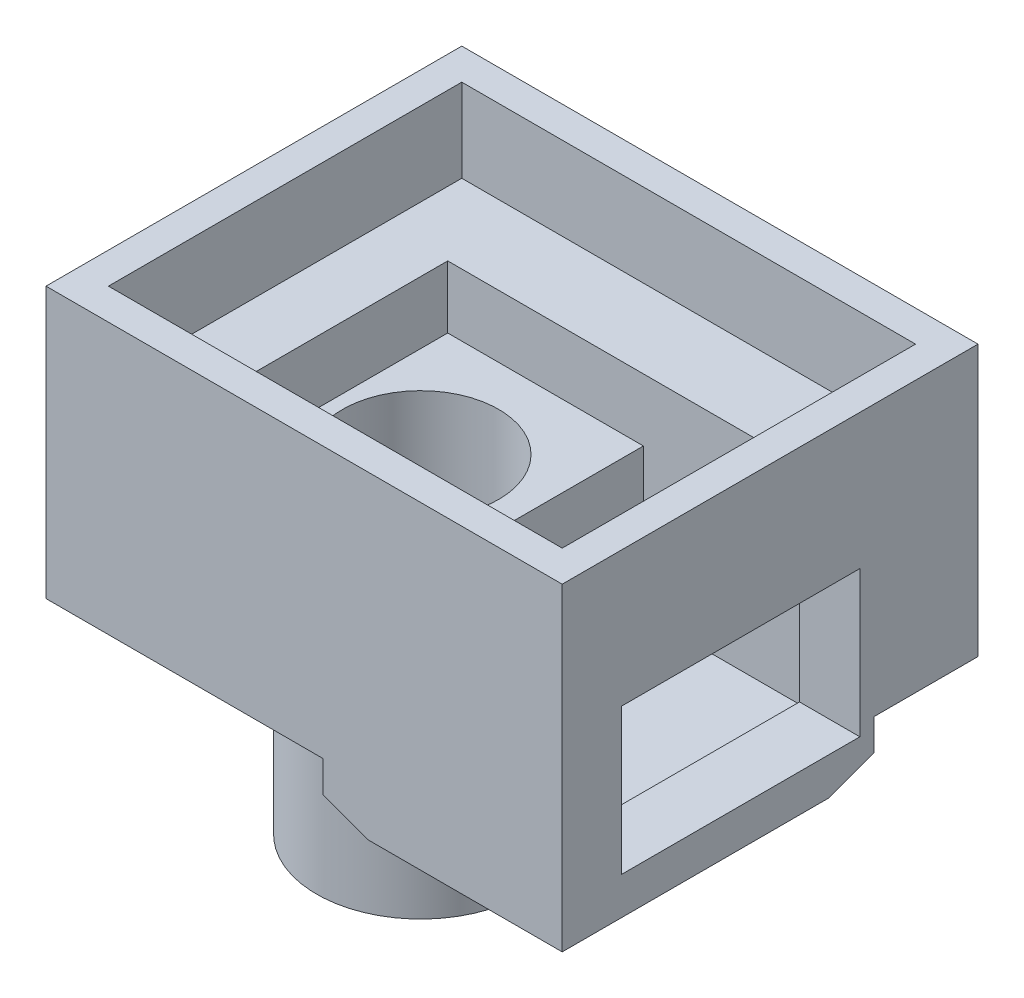
ISO-10303-21;
HEADER;
FILE_DESCRIPTION(('STEP AP214'),'2;1');
FILE_NAME('part.step','',(''),(''),'','','');
FILE_SCHEMA(('AUTOMOTIVE_DESIGN { 1 0 10303 214 1 1 1 1 }'));
ENDSEC;
DATA;
#1=APPLICATION_CONTEXT('core data for automotive mechanical design processes');
#2=APPLICATION_PROTOCOL_DEFINITION('international standard','automotive_design',2000,#1);
#3=PRODUCT_CONTEXT('',#1,'mechanical');
#4=PRODUCT('Part','Part','',(#3));
#5=PRODUCT_RELATED_PRODUCT_CATEGORY('part','',(#4));
#6=PRODUCT_DEFINITION_FORMATION('','',#4);
#7=PRODUCT_DEFINITION_CONTEXT('part definition',#1,'design');
#8=PRODUCT_DEFINITION('design','',#6,#7);
#9=PRODUCT_DEFINITION_SHAPE('','',#8);
#10=(LENGTH_UNIT() NAMED_UNIT(*) SI_UNIT(.MILLI.,.METRE.));
#11=(NAMED_UNIT(*) PLANE_ANGLE_UNIT() SI_UNIT($,.RADIAN.));
#12=(NAMED_UNIT(*) SI_UNIT($,.STERADIAN.) SOLID_ANGLE_UNIT());
#13=UNCERTAINTY_MEASURE_WITH_UNIT(LENGTH_MEASURE(1.E-05),#10,'distance_accuracy_value','');
#14=(GEOMETRIC_REPRESENTATION_CONTEXT(3) GLOBAL_UNCERTAINTY_ASSIGNED_CONTEXT((#13)) GLOBAL_UNIT_ASSIGNED_CONTEXT((#10,
#11,#12)) REPRESENTATION_CONTEXT('',''));
#15=CARTESIAN_POINT('',(0.,0.,0.));
#16=DIRECTION('',(0.,0.,1.));
#17=DIRECTION('',(1.,0.,0.));
#18=AXIS2_PLACEMENT_3D('',#15,#16,#17);
#19=CARTESIAN_POINT('',(15.8,0.,0.));
#20=DIRECTION('',(-1.,0.,0.));
#21=DIRECTION('',(0.,0.,1.));
#22=AXIS2_PLACEMENT_3D('',#19,#20,#21);
#23=PLANE('',#22);
#24=DIRECTION('',(0.,0.,1.));
#25=VECTOR('',#24,1.);
#26=CARTESIAN_POINT('',(15.8,16.3,0.));
#27=LINE('',#26,#25);
#28=CARTESIAN_POINT('',(15.8,16.3,-5.3));
#29=VERTEX_POINT('',#28);
#30=CARTESIAN_POINT('',(15.8,16.3,6.15));
#31=VERTEX_POINT('',#30);
#32=EDGE_CURVE('E252',#29,#31,#27,.T.);
#33=ORIENTED_EDGE('',*,*,#32,.F.);
#34=DIRECTION('',(0.,-1.,0.));
#35=VECTOR('',#34,1.);
#36=CARTESIAN_POINT('',(15.8,0.,-5.3));
#37=LINE('',#36,#35);
#38=CARTESIAN_POINT('',(15.8,9.3,-5.3));
#39=VERTEX_POINT('',#38);
#40=EDGE_CURVE('E264',#29,#39,#37,.T.);
#41=ORIENTED_EDGE('',*,*,#40,.T.);
#42=DIRECTION('',(0.,0.,1.));
#43=VECTOR('',#42,1.);
#44=CARTESIAN_POINT('',(15.8,9.3,0.));
#45=LINE('',#44,#43);
#46=CARTESIAN_POINT('',(15.8,9.3,6.15));
#47=VERTEX_POINT('',#46);
#48=EDGE_CURVE('E266',#39,#47,#45,.T.);
#49=ORIENTED_EDGE('',*,*,#48,.T.);
#50=DIRECTION('',(0.,-1.,0.));
#51=VECTOR('',#50,1.);
#52=CARTESIAN_POINT('',(15.8,0.,6.15));
#53=LINE('',#52,#51);
#54=EDGE_CURVE('E258',#31,#47,#53,.T.);
#55=ORIENTED_EDGE('',*,*,#54,.F.);
#56=EDGE_LOOP('',(#33,#41,#49,#55));
#57=FACE_BOUND('',#56,.T.);
#58=DIRECTION('',(0.,0.,1.));
#59=VECTOR('',#58,1.);
#60=CARTESIAN_POINT('',(15.8,7.5,-5.9749371855331));
#61=LINE('',#60,#59);
#62=CARTESIAN_POINT('',(15.8,7.5,-3.77695524996939));
#63=VERTEX_POINT('',#62);
#64=CARTESIAN_POINT('',(15.8,7.5,9.));
#65=VERTEX_POINT('',#64);
#66=EDGE_CURVE('E581',#63,#65,#61,.T.);
#67=ORIENTED_EDGE('',*,*,#66,.F.);
#68=DIRECTION('',(0.,0.34202014332567,-0.939692620785908));
#69=VECTOR('',#68,1.);
#70=CARTESIAN_POINT('',(15.8,7.5,-3.7769552499694));
#71=LINE('',#70,#69);
#72=CARTESIAN_POINT('',(15.8,8.30000000000001,-5.9749371855331));
#73=VERTEX_POINT('',#72);
#74=EDGE_CURVE('E557',#63,#73,#71,.T.);
#75=ORIENTED_EDGE('',*,*,#74,.T.);
#76=DIRECTION('',(0.,1.,0.));
#77=VECTOR('',#76,1.);
#78=CARTESIAN_POINT('',(15.8,6.8,-5.9749371855331));
#79=LINE('',#78,#77);
#80=CARTESIAN_POINT('',(15.8,9.8,-5.9749371855331));
#81=VERTEX_POINT('',#80);
#82=EDGE_CURVE('E299',#73,#81,#79,.T.);
#83=ORIENTED_EDGE('',*,*,#82,.T.);
#84=DIRECTION('',(0.,0.,-1.));
#85=VECTOR('',#84,1.);
#86=CARTESIAN_POINT('',(15.8,9.8,-5.9749371855331));
#87=LINE('',#86,#85);
#88=CARTESIAN_POINT('',(15.8,9.8,-10.9749371855331));
#89=VERTEX_POINT('',#88);
#90=EDGE_CURVE('E310',#81,#89,#87,.T.);
#91=ORIENTED_EDGE('',*,*,#90,.T.);
#92=DIRECTION('',(0.,1.,0.));
#93=VECTOR('',#92,1.);
#94=CARTESIAN_POINT('',(15.8,9.8,-10.9749371855331));
#95=LINE('',#94,#93);
#96=CARTESIAN_POINT('',(15.8,22.8,-10.9749371855331));
#97=VERTEX_POINT('',#96);
#98=EDGE_CURVE('E311',#89,#97,#95,.T.);
#99=ORIENTED_EDGE('',*,*,#98,.T.);
#100=DIRECTION('',(0.,0.,1.));
#101=VECTOR('',#100,1.);
#102=CARTESIAN_POINT('',(15.8,22.8,-10.9749371855331));
#103=LINE('',#102,#101);
#104=CARTESIAN_POINT('',(15.8,22.8,9.));
#105=VERTEX_POINT('',#104);
#106=EDGE_CURVE('E314',#97,#105,#103,.T.);
#107=ORIENTED_EDGE('',*,*,#106,.T.);
#108=DIRECTION('',(0.,-1.,0.));
#109=VECTOR('',#108,1.);
#110=CARTESIAN_POINT('',(15.8,22.8,9.));
#111=LINE('',#110,#109);
#112=EDGE_CURVE('E316',#105,#65,#111,.T.);
#113=ORIENTED_EDGE('',*,*,#112,.T.);
#114=EDGE_LOOP('',(#67,#75,#83,#91,#99,#107,#113));
#115=FACE_BOUND('',#114,.T.);
#116=ADVANCED_FACE('F47',(#57,#115),#23,.F.);
#117=CARTESIAN_POINT('',(4.3,6.8,-5.9749371855331));
#118=DIRECTION('',(1.,0.,0.));
#119=DIRECTION('',(0.,0.,-1.));
#120=AXIS2_PLACEMENT_3D('',#117,#118,#119);
#121=PLANE('',#120);
#122=DIRECTION('',(0.,-1.,0.));
#123=VECTOR('',#122,1.);
#124=CARTESIAN_POINT('',(4.3,15.8,2.55147016443461));
#125=LINE('',#124,#123);
#126=CARTESIAN_POINT('',(4.3,9.8,2.55147016443462));
#127=VERTEX_POINT('',#126);
#128=CARTESIAN_POINT('',(4.3,8.30000000000001,2.55147016443461));
#129=VERTEX_POINT('',#128);
#130=EDGE_CURVE('E422',#127,#129,#125,.T.);
#131=ORIENTED_EDGE('',*,*,#130,.T.);
#132=DIRECTION('',(0.,0.,1.));
#133=VECTOR('',#132,1.);
#134=CARTESIAN_POINT('',(4.3,8.30000000000001,0.));
#135=LINE('',#134,#133);
#136=CARTESIAN_POINT('',(4.3,8.30000000000001,9.));
#137=VERTEX_POINT('',#136);
#138=EDGE_CURVE('E75',#129,#137,#135,.T.);
#139=ORIENTED_EDGE('',*,*,#138,.T.);
#140=DIRECTION('',(0.,-1.,0.));
#141=VECTOR('',#140,1.);
#142=CARTESIAN_POINT('',(4.3,9.8,9.));
#143=LINE('',#142,#141);
#144=CARTESIAN_POINT('',(4.3,9.8,9.));
#145=VERTEX_POINT('',#144);
#146=EDGE_CURVE('E355',#145,#137,#143,.T.);
#147=ORIENTED_EDGE('',*,*,#146,.F.);
#148=DIRECTION('',(0.,0.,-1.));
#149=VECTOR('',#148,1.);
#150=CARTESIAN_POINT('',(4.3,9.8,-5.9749371855331));
#151=LINE('',#150,#149);
#152=EDGE_CURVE('E409',#145,#127,#151,.T.);
#153=ORIENTED_EDGE('',*,*,#152,.T.);
#154=EDGE_LOOP('',(#131,#139,#147,#153));
#155=FACE_BOUND('',#154,.T.);
#156=ADVANCED_FACE('F611',(#155),#121,.F.);
#157=DIRECTION('',(0.,1.,0.));
#158=VECTOR('',#157,1.);
#159=CARTESIAN_POINT('',(4.3,6.8,-5.9749371855331));
#160=LINE('',#159,#158);
#161=CARTESIAN_POINT('',(4.3,8.30000000000001,-5.9749371855331));
#162=VERTEX_POINT('',#161);
#163=CARTESIAN_POINT('',(4.3,9.8,-5.9749371855331));
#164=VERTEX_POINT('',#163);
#165=EDGE_CURVE('E417',#162,#164,#160,.T.);
#166=ORIENTED_EDGE('',*,*,#165,.F.);
#167=DIRECTION('',(0.,0.,1.));
#168=VECTOR('',#167,1.);
#169=CARTESIAN_POINT('',(4.3,8.30000000000001,-2.55147016443461));
#170=LINE('',#169,#168);
#171=CARTESIAN_POINT('',(4.3,8.30000000000001,-2.55147016443461));
#172=VERTEX_POINT('',#171);
#173=EDGE_CURVE('E566',#162,#172,#170,.T.);
#174=ORIENTED_EDGE('',*,*,#173,.T.);
#175=DIRECTION('',(0.,-1.,0.));
#176=VECTOR('',#175,1.);
#177=CARTESIAN_POINT('',(4.3,15.8,-2.55147016443461));
#178=LINE('',#177,#176);
#179=CARTESIAN_POINT('',(4.3,9.8,-2.55147016443461));
#180=VERTEX_POINT('',#179);
#181=EDGE_CURVE('E416',#172,#180,#178,.F.);
#182=ORIENTED_EDGE('',*,*,#181,.T.);
#183=EDGE_CURVE('E415',#180,#164,#151,.T.);
#184=ORIENTED_EDGE('',*,*,#183,.T.);
#185=EDGE_LOOP('',(#166,#174,#182,#184));
#186=FACE_BOUND('',#185,.T.);
#187=ADVANCED_FACE('F694',(#186),#121,.F.);
#188=CARTESIAN_POINT('',(14.8,6.8,-5.9749371855331));
#189=DIRECTION('',(0.,0.,1.));
#190=DIRECTION('',(1.,0.,0.));
#191=AXIS2_PLACEMENT_3D('',#188,#189,#190);
#192=PLANE('',#191);
#193=ORIENTED_EDGE('',*,*,#82,.F.);
#194=DIRECTION('',(-1.,0.,0.));
#195=VECTOR('',#194,1.);
#196=CARTESIAN_POINT('',(4.3,8.30000000000001,-5.9749371855331));
#197=LINE('',#196,#195);
#198=EDGE_CURVE('E563',#73,#162,#197,.T.);
#199=ORIENTED_EDGE('',*,*,#198,.T.);
#200=ORIENTED_EDGE('',*,*,#165,.T.);
#201=DIRECTION('',(1.,0.,0.));
#202=VECTOR('',#201,1.);
#203=CARTESIAN_POINT('',(14.8,9.8,-5.9749371855331));
#204=LINE('',#203,#202);
#205=EDGE_CURVE('E412',#164,#81,#204,.T.);
#206=ORIENTED_EDGE('',*,*,#205,.T.);
#207=EDGE_LOOP('',(#193,#199,#200,#206));
#208=FACE_BOUND('',#207,.T.);
#209=ADVANCED_FACE('F715',(#208),#192,.F.);
#210=CARTESIAN_POINT('',(12.9,-5.81000925497257,-5.7));
#211=DIRECTION('',(1.,0.,0.));
#212=DIRECTION('',(0.,0.,-1.));
#213=AXIS2_PLACEMENT_3D('',#210,#211,#212);
#214=PLANE('',#213);
#215=DIRECTION('',(0.,0.,1.));
#216=VECTOR('',#215,1.);
#217=CARTESIAN_POINT('',(12.9,18.8,-5.7));
#218=LINE('',#217,#216);
#219=CARTESIAN_POINT('',(12.9,18.8,-5.7));
#220=VERTEX_POINT('',#219);
#221=CARTESIAN_POINT('',(12.9,18.8,7.5));
#222=VERTEX_POINT('',#221);
#223=EDGE_CURVE('E447',#220,#222,#218,.T.);
#224=ORIENTED_EDGE('',*,*,#223,.F.);
#225=DIRECTION('',(0.,1.,0.));
#226=VECTOR('',#225,1.);
#227=CARTESIAN_POINT('',(12.9,-5.81000925497257,-5.7));
#228=LINE('',#227,#226);
#229=CARTESIAN_POINT('',(12.9,8.8,-5.7));
#230=VERTEX_POINT('',#229);
#231=EDGE_CURVE('E464',#230,#220,#228,.T.);
#232=ORIENTED_EDGE('',*,*,#231,.F.);
#233=DIRECTION('',(0.,0.,-1.));
#234=VECTOR('',#233,1.);
#235=CARTESIAN_POINT('',(12.9,8.8,-5.7));
#236=LINE('',#235,#234);
#237=CARTESIAN_POINT('',(12.9,8.8,7.5));
#238=VERTEX_POINT('',#237);
#239=EDGE_CURVE('E395',#238,#230,#236,.T.);
#240=ORIENTED_EDGE('',*,*,#239,.F.);
#241=DIRECTION('',(0.,-1.,0.));
#242=VECTOR('',#241,1.);
#243=CARTESIAN_POINT('',(12.9,18.8,7.5));
#244=LINE('',#243,#242);
#245=EDGE_CURVE('E353',#222,#238,#244,.T.);
#246=ORIENTED_EDGE('',*,*,#245,.F.);
#247=EDGE_LOOP('',(#224,#232,#240,#246));
#248=FACE_BOUND('',#247,.T.);
#249=DIRECTION('',(0.,0.,1.));
#250=VECTOR('',#249,1.);
#251=CARTESIAN_POINT('',(12.9,16.3,0.));
#252=LINE('',#251,#250);
#253=CARTESIAN_POINT('',(12.9,16.3,-5.3));
#254=VERTEX_POINT('',#253);
#255=CARTESIAN_POINT('',(12.9,16.3,6.15));
#256=VERTEX_POINT('',#255);
#257=EDGE_CURVE('E251',#254,#256,#252,.T.);
#258=ORIENTED_EDGE('',*,*,#257,.T.);
#259=DIRECTION('',(0.,-1.,0.));
#260=VECTOR('',#259,1.);
#261=CARTESIAN_POINT('',(12.9,0.,6.15));
#262=LINE('',#261,#260);
#263=CARTESIAN_POINT('',(12.9,9.3,6.15));
#264=VERTEX_POINT('',#263);
#265=EDGE_CURVE('E274',#256,#264,#262,.T.);
#266=ORIENTED_EDGE('',*,*,#265,.T.);
#267=DIRECTION('',(0.,0.,1.));
#268=VECTOR('',#267,1.);
#269=CARTESIAN_POINT('',(12.9,9.3,0.));
#270=LINE('',#269,#268);
#271=CARTESIAN_POINT('',(12.9,9.3,-5.3));
#272=VERTEX_POINT('',#271);
#273=EDGE_CURVE('E279',#272,#264,#270,.T.);
#274=ORIENTED_EDGE('',*,*,#273,.F.);
#275=DIRECTION('',(0.,-1.,0.));
#276=VECTOR('',#275,1.);
#277=CARTESIAN_POINT('',(12.9,0.,-5.3));
#278=LINE('',#277,#276);
#279=EDGE_CURVE('E288',#254,#272,#278,.T.);
#280=ORIENTED_EDGE('',*,*,#279,.F.);
#281=EDGE_LOOP('',(#258,#266,#274,#280));
#282=FACE_BOUND('',#281,.T.);
#283=ADVANCED_FACE('F655',(#248,#282),#214,.F.);
#284=CARTESIAN_POINT('',(0.,18.8,0.));
#285=DIRECTION('',(0.,1.,0.));
#286=DIRECTION('',(0.,0.,1.));
#287=AXIS2_PLACEMENT_3D('',#284,#285,#286);
#288=PLANE('',#287);
#289=DIRECTION('',(1.,0.,0.));
#290=VECTOR('',#289,1.);
#291=CARTESIAN_POINT('',(-7.5,18.8,7.5));
#292=LINE('',#291,#290);
#293=CARTESIAN_POINT('',(-7.5,18.8,7.5));
#294=VERTEX_POINT('',#293);
#295=CARTESIAN_POINT('',(-4.4,18.8,7.5));
#296=VERTEX_POINT('',#295);
#297=EDGE_CURVE('E432',#294,#296,#292,.T.);
#298=ORIENTED_EDGE('',*,*,#297,.T.);
#299=DIRECTION('',(0.,0.,-1.));
#300=VECTOR('',#299,1.);
#301=CARTESIAN_POINT('',(-4.4,18.8,-5.7));
#302=LINE('',#301,#300);
#303=CARTESIAN_POINT('',(-4.4,18.8,-5.7));
#304=VERTEX_POINT('',#303);
#305=EDGE_CURVE('E456',#296,#304,#302,.T.);
#306=ORIENTED_EDGE('',*,*,#305,.T.);
#307=DIRECTION('',(1.,0.,0.));
#308=VECTOR('',#307,1.);
#309=CARTESIAN_POINT('',(-4.4,18.8,-5.7));
#310=LINE('',#309,#308);
#311=EDGE_CURVE('E460',#304,#220,#310,.T.);
#312=ORIENTED_EDGE('',*,*,#311,.T.);
#313=ORIENTED_EDGE('',*,*,#223,.T.);
#314=CARTESIAN_POINT('',(14.3,18.8,7.5));
#315=VERTEX_POINT('',#314);
#316=EDGE_CURVE('E433',#222,#315,#292,.T.);
#317=ORIENTED_EDGE('',*,*,#316,.T.);
#318=DIRECTION('',(0.,0.,-1.));
#319=VECTOR('',#318,1.);
#320=CARTESIAN_POINT('',(14.3,18.8,7.5));
#321=LINE('',#320,#319);
#322=CARTESIAN_POINT('',(14.3,18.8,-9.4749371855331));
#323=VERTEX_POINT('',#322);
#324=EDGE_CURVE('E438',#315,#323,#321,.T.);
#325=ORIENTED_EDGE('',*,*,#324,.T.);
#326=DIRECTION('',(-1.,0.,0.));
#327=VECTOR('',#326,1.);
#328=CARTESIAN_POINT('',(14.3,18.8,-9.4749371855331));
#329=LINE('',#328,#327);
#330=CARTESIAN_POINT('',(-7.5,18.8,-9.4749371855331));
#331=VERTEX_POINT('',#330);
#332=EDGE_CURVE('E424',#323,#331,#329,.T.);
#333=ORIENTED_EDGE('',*,*,#332,.T.);
#334=DIRECTION('',(0.,0.,1.));
#335=VECTOR('',#334,1.);
#336=CARTESIAN_POINT('',(-7.5,18.8,-9.4749371855331));
#337=LINE('',#336,#335);
#338=EDGE_CURVE('E429',#331,#294,#337,.T.);
#339=ORIENTED_EDGE('',*,*,#338,.T.);
#340=EDGE_LOOP('',(#298,#306,#312,#313,#317,#325,#333,#339));
#341=FACE_BOUND('',#340,.T.);
#342=ADVANCED_FACE('F625',(#341),#288,.T.);
#343=CARTESIAN_POINT('',(0.,15.8,0.));
#344=DIRECTION('',(0.,-1.,0.));
#345=DIRECTION('',(0.,0.,-1.));
#346=AXIS2_PLACEMENT_3D('',#343,#344,#345);
#347=CYLINDRICAL_SURFACE('',#346,5.);
#348=ORIENTED_EDGE('',*,*,#181,.F.);
#349=CARTESIAN_POINT('',(0.,9.86507200734468,0.));
#350=DIRECTION('',(-0.34202014332567,-0.939692620785908,0.));
#351=DIRECTION('',(0.939692620785908,-0.34202014332567,0.));
#352=AXIS2_PLACEMENT_3D('',#349,#350,#351);
#353=ELLIPSE('',#352,5.32088886237956,5.);
#354=EDGE_CURVE('E12',#172,#129,#353,.T.);
#355=ORIENTED_EDGE('',*,*,#354,.T.);
#356=ORIENTED_EDGE('',*,*,#130,.F.);
#357=CARTESIAN_POINT('',(0.,9.8,0.));
#358=DIRECTION('',(0.,-1.,0.));
#359=DIRECTION('',(0.,0.,1.));
#360=AXIS2_PLACEMENT_3D('',#357,#358,#359);
#361=CIRCLE('',#360,5.);
#362=CARTESIAN_POINT('',(-0.499999999999996,9.8,-4.9749371855331));
#363=VERTEX_POINT('',#362);
#364=EDGE_CURVE('E475',#127,#363,#361,.T.);
#365=ORIENTED_EDGE('',*,*,#364,.T.);
#366=DIRECTION('',(0.,-1.,0.));
#367=VECTOR('',#366,1.);
#368=CARTESIAN_POINT('',(-0.5,15.8,-4.9749371855331));
#369=LINE('',#368,#367);
#370=CARTESIAN_POINT('',(-0.499999999999993,2.5,-4.9749371855331));
#371=VERTEX_POINT('',#370);
#372=EDGE_CURVE('E503',#363,#371,#369,.T.);
#373=ORIENTED_EDGE('',*,*,#372,.T.);
#374=DIRECTION('',(0.,-1.,0.));
#375=VECTOR('',#374,1.);
#376=CARTESIAN_POINT('',(-0.499999999999993,15.8,-4.9749371855331));
#377=LINE('',#376,#375);
#378=CARTESIAN_POINT('',(-0.5,0.,-4.9749371855331));
#379=VERTEX_POINT('',#378);
#380=EDGE_CURVE('E507',#371,#379,#377,.T.);
#381=ORIENTED_EDGE('',*,*,#380,.T.);
#382=CARTESIAN_POINT('',(0.,0.,0.));
#383=DIRECTION('',(0.,1.,0.));
#384=DIRECTION('',(0.,0.,1.));
#385=AXIS2_PLACEMENT_3D('',#382,#383,#384);
#386=CIRCLE('',#385,5.);
#387=CARTESIAN_POINT('',(0.5,0.,-4.9749371855331));
#388=VERTEX_POINT('',#387);
#389=EDGE_CURVE('E529',#379,#388,#386,.T.);
#390=ORIENTED_EDGE('',*,*,#389,.T.);
#391=DIRECTION('',(0.,-1.,0.));
#392=VECTOR('',#391,1.);
#393=CARTESIAN_POINT('',(0.5,0.,-4.9749371855331));
#394=LINE('',#393,#392);
#395=CARTESIAN_POINT('',(0.5,2.5,-4.9749371855331));
#396=VERTEX_POINT('',#395);
#397=EDGE_CURVE('E494',#396,#388,#394,.T.);
#398=ORIENTED_EDGE('',*,*,#397,.F.);
#399=DIRECTION('',(0.,-1.,0.));
#400=VECTOR('',#399,1.);
#401=CARTESIAN_POINT('',(0.5,15.8,-4.9749371855331));
#402=LINE('',#401,#400);
#403=CARTESIAN_POINT('',(0.5,9.8,-4.9749371855331));
#404=VERTEX_POINT('',#403);
#405=EDGE_CURVE('E545',#404,#396,#402,.T.);
#406=ORIENTED_EDGE('',*,*,#405,.F.);
#407=EDGE_CURVE('E479',#404,#180,#361,.T.);
#408=ORIENTED_EDGE('',*,*,#407,.T.);
#409=EDGE_LOOP('',(#348,#355,#356,#365,#373,#381,#390,#398,#406,#408));
#410=FACE_BOUND('',#409,.T.);
#411=ADVANCED_FACE('F613',(#410),#347,.T.);
#412=CARTESIAN_POINT('',(-4.4,-5.81000925497257,-5.7));
#413=DIRECTION('',(-1.,0.,0.));
#414=DIRECTION('',(0.,0.,1.));
#415=AXIS2_PLACEMENT_3D('',#412,#413,#414);
#416=PLANE('',#415);
#417=DIRECTION('',(0.,1.,0.));
#418=VECTOR('',#417,1.);
#419=CARTESIAN_POINT('',(-4.4,-5.81000925497257,-5.7));
#420=LINE('',#419,#418);
#421=CARTESIAN_POINT('',(-4.4,15.8,-5.7));
#422=VERTEX_POINT('',#421);
#423=EDGE_CURVE('E469',#422,#304,#420,.T.);
#424=ORIENTED_EDGE('',*,*,#423,.T.);
#425=ORIENTED_EDGE('',*,*,#305,.F.);
#426=DIRECTION('',(0.,1.,0.));
#427=VECTOR('',#426,1.);
#428=CARTESIAN_POINT('',(-4.4,15.8,7.5));
#429=LINE('',#428,#427);
#430=CARTESIAN_POINT('',(-4.4,15.8,7.5));
#431=VERTEX_POINT('',#430);
#432=EDGE_CURVE('E358',#431,#296,#429,.T.);
#433=ORIENTED_EDGE('',*,*,#432,.F.);
#434=DIRECTION('',(0.,0.,-1.));
#435=VECTOR('',#434,1.);
#436=CARTESIAN_POINT('',(-4.4,15.8,-5.7));
#437=LINE('',#436,#435);
#438=EDGE_CURVE('E466',#431,#422,#437,.T.);
#439=ORIENTED_EDGE('',*,*,#438,.T.);
#440=EDGE_LOOP('',(#424,#425,#433,#439));
#441=FACE_BOUND('',#440,.T.);
#442=ADVANCED_FACE('F641',(#441),#416,.F.);
#443=CARTESIAN_POINT('',(-4.4,-5.81000925497257,-5.7));
#444=DIRECTION('',(0.,0.,-1.));
#445=DIRECTION('',(-1.,0.,0.));
#446=AXIS2_PLACEMENT_3D('',#443,#444,#445);
#447=PLANE('',#446);
#448=ORIENTED_EDGE('',*,*,#311,.F.);
#449=ORIENTED_EDGE('',*,*,#423,.F.);
#450=DIRECTION('',(1.,0.,0.));
#451=VECTOR('',#450,1.);
#452=CARTESIAN_POINT('',(-4.4,15.8,-5.7));
#453=LINE('',#452,#451);
#454=CARTESIAN_POINT('',(5.,15.8,-5.7));
#455=VERTEX_POINT('',#454);
#456=EDGE_CURVE('E461',#422,#455,#453,.T.);
#457=ORIENTED_EDGE('',*,*,#456,.T.);
#458=DIRECTION('',(0.,1.,0.));
#459=VECTOR('',#458,1.);
#460=CARTESIAN_POINT('',(5.,8.8,-5.7));
#461=LINE('',#460,#459);
#462=CARTESIAN_POINT('',(5.,8.8,-5.7));
#463=VERTEX_POINT('',#462);
#464=EDGE_CURVE('E401',#463,#455,#461,.T.);
#465=ORIENTED_EDGE('',*,*,#464,.F.);
#466=DIRECTION('',(-1.,0.,0.));
#467=VECTOR('',#466,1.);
#468=CARTESIAN_POINT('',(12.9,8.8,-5.7));
#469=LINE('',#468,#467);
#470=EDGE_CURVE('E397',#230,#463,#469,.T.);
#471=ORIENTED_EDGE('',*,*,#470,.F.);
#472=ORIENTED_EDGE('',*,*,#231,.T.);
#473=EDGE_LOOP('',(#448,#449,#457,#465,#471,#472));
#474=FACE_BOUND('',#473,.T.);
#475=ADVANCED_FACE('F646',(#474),#447,.F.);
#476=CARTESIAN_POINT('',(0.,15.8,0.));
#477=DIRECTION('',(0.,1.,0.));
#478=DIRECTION('',(0.,0.,1.));
#479=AXIS2_PLACEMENT_3D('',#476,#477,#478);
#480=PLANE('',#479);
#481=DIRECTION('',(0.,0.,1.));
#482=VECTOR('',#481,1.);
#483=CARTESIAN_POINT('',(5.,15.8,-5.7));
#484=LINE('',#483,#482);
#485=CARTESIAN_POINT('',(5.,15.8,7.5));
#486=VERTEX_POINT('',#485);
#487=EDGE_CURVE('E392',#455,#486,#484,.T.);
#488=ORIENTED_EDGE('',*,*,#487,.F.);
#489=ORIENTED_EDGE('',*,*,#456,.F.);
#490=ORIENTED_EDGE('',*,*,#438,.F.);
#491=DIRECTION('',(-1.,0.,0.));
#492=VECTOR('',#491,1.);
#493=CARTESIAN_POINT('',(5.,15.8,7.5));
#494=LINE('',#493,#492);
#495=EDGE_CURVE('E363',#486,#431,#494,.T.);
#496=ORIENTED_EDGE('',*,*,#495,.F.);
#497=EDGE_LOOP('',(#488,#489,#490,#496));
#498=FACE_BOUND('',#497,.T.);
#499=CARTESIAN_POINT('',(0.,15.8,0.));
#500=DIRECTION('',(0.,1.,0.));
#501=DIRECTION('',(0.,0.,1.));
#502=AXIS2_PLACEMENT_3D('',#499,#500,#501);
#503=CIRCLE('',#502,3.75);
#504=CARTESIAN_POINT('',(0.,15.8,3.75));
#505=VERTEX_POINT('',#504);
#506=EDGE_CURVE('E516',#505,#505,#503,.T.);
#507=ORIENTED_EDGE('',*,*,#506,.F.);
#508=EDGE_LOOP('',(#507));
#509=FACE_BOUND('',#508,.T.);
#510=ADVANCED_FACE('F661',(#498,#509),#480,.T.);
#511=CARTESIAN_POINT('',(0.,15.8,0.));
#512=DIRECTION('',(0.,-1.,0.));
#513=DIRECTION('',(0.,0.,-1.));
#514=AXIS2_PLACEMENT_3D('',#511,#512,#513);
#515=CYLINDRICAL_SURFACE('',#514,2.5);
#516=CARTESIAN_POINT('',(0.,0.,0.));
#517=DIRECTION('',(0.,1.,0.));
#518=DIRECTION('',(0.,0.,1.));
#519=AXIS2_PLACEMENT_3D('',#516,#517,#518);
#520=CIRCLE('',#519,2.5);
#521=CARTESIAN_POINT('',(0.,0.,2.5));
#522=VERTEX_POINT('',#521);
#523=EDGE_CURVE('E535',#522,#522,#520,.T.);
#524=ORIENTED_EDGE('',*,*,#523,.F.);
#525=EDGE_LOOP('',(#524));
#526=FACE_BOUND('',#525,.T.);
#527=CARTESIAN_POINT('',(0.,2.8,0.));
#528=DIRECTION('',(0.,1.,0.));
#529=DIRECTION('',(0.,0.,1.));
#530=AXIS2_PLACEMENT_3D('',#527,#528,#529);
#531=CIRCLE('',#530,2.5);
#532=CARTESIAN_POINT('',(0.,2.8,2.5));
#533=VERTEX_POINT('',#532);
#534=EDGE_CURVE('E524',#533,#533,#531,.T.);
#535=ORIENTED_EDGE('',*,*,#534,.T.);
#536=EDGE_LOOP('',(#535));
#537=FACE_BOUND('',#536,.T.);
#538=ADVANCED_FACE('F667',(#526,#537),#515,.F.);
#539=CARTESIAN_POINT('',(-0.5,15.8,0.));
#540=DIRECTION('',(-1.,0.,0.));
#541=DIRECTION('',(0.,0.,1.));
#542=AXIS2_PLACEMENT_3D('',#539,#540,#541);
#543=PLANE('',#542);
#544=DIRECTION('',(0.,0.,1.));
#545=VECTOR('',#544,1.);
#546=CARTESIAN_POINT('',(-0.5,9.8,0.));
#547=LINE('',#546,#545);
#548=CARTESIAN_POINT('',(-0.5,9.8,-7.));
#549=VERTEX_POINT('',#548);
#550=EDGE_CURVE('E484',#549,#363,#547,.T.);
#551=ORIENTED_EDGE('',*,*,#550,.F.);
#552=DIRECTION('',(0.,-1.,0.));
#553=VECTOR('',#552,1.);
#554=CARTESIAN_POINT('',(-0.5,15.8,-7.));
#555=LINE('',#554,#553);
#556=CARTESIAN_POINT('',(-0.5,2.5,-7.));
#557=VERTEX_POINT('',#556);
#558=EDGE_CURVE('E537',#549,#557,#555,.T.);
#559=ORIENTED_EDGE('',*,*,#558,.T.);
#560=DIRECTION('',(0.,0.,-1.));
#561=VECTOR('',#560,1.);
#562=CARTESIAN_POINT('',(-0.5,2.5,0.));
#563=LINE('',#562,#561);
#564=EDGE_CURVE('E513',#371,#557,#563,.T.);
#565=ORIENTED_EDGE('',*,*,#564,.F.);
#566=ORIENTED_EDGE('',*,*,#372,.F.);
#567=EDGE_LOOP('',(#551,#559,#565,#566));
#568=FACE_BOUND('',#567,.T.);
#569=ADVANCED_FACE('F763',(#568),#543,.T.);
#570=CARTESIAN_POINT('',(0.5,15.8,0.));
#571=DIRECTION('',(1.,0.,0.));
#572=DIRECTION('',(0.,0.,-1.));
#573=AXIS2_PLACEMENT_3D('',#570,#571,#572);
#574=PLANE('',#573);
#575=DIRECTION('',(0.,0.,-1.));
#576=VECTOR('',#575,1.);
#577=CARTESIAN_POINT('',(0.5,9.8,0.));
#578=LINE('',#577,#576);
#579=CARTESIAN_POINT('',(0.5,9.8,-7.));
#580=VERTEX_POINT('',#579);
#581=EDGE_CURVE('E481',#404,#580,#578,.T.);
#582=ORIENTED_EDGE('',*,*,#581,.F.);
#583=ORIENTED_EDGE('',*,*,#405,.T.);
#584=DIRECTION('',(0.,0.,1.));
#585=VECTOR('',#584,1.);
#586=CARTESIAN_POINT('',(0.5,2.5,-7.));
#587=LINE('',#586,#585);
#588=CARTESIAN_POINT('',(0.5,2.5,-7.));
#589=VERTEX_POINT('',#588);
#590=EDGE_CURVE('E487',#589,#396,#587,.T.);
#591=ORIENTED_EDGE('',*,*,#590,.F.);
#592=DIRECTION('',(0.,-1.,0.));
#593=VECTOR('',#592,1.);
#594=CARTESIAN_POINT('',(0.5,15.8,-7.));
#595=LINE('',#594,#593);
#596=EDGE_CURVE('E536',#580,#589,#595,.T.);
#597=ORIENTED_EDGE('',*,*,#596,.F.);
#598=EDGE_LOOP('',(#582,#583,#591,#597));
#599=FACE_BOUND('',#598,.T.);
#600=ADVANCED_FACE('F751',(#599),#574,.T.);
#601=CARTESIAN_POINT('',(0.,15.8,-7.));
#602=DIRECTION('',(0.,0.,-1.));
#603=DIRECTION('',(-1.,0.,0.));
#604=AXIS2_PLACEMENT_3D('',#601,#602,#603);
#605=PLANE('',#604);
#606=DIRECTION('',(-1.,0.,0.));
#607=VECTOR('',#606,1.);
#608=CARTESIAN_POINT('',(0.,9.8,-7.));
#609=LINE('',#608,#607);
#610=EDGE_CURVE('E505',#580,#549,#609,.T.);
#611=ORIENTED_EDGE('',*,*,#610,.F.);
#612=ORIENTED_EDGE('',*,*,#596,.T.);
#613=DIRECTION('',(1.,0.,0.));
#614=VECTOR('',#613,1.);
#615=CARTESIAN_POINT('',(-5.,2.5,-7.));
#616=LINE('',#615,#614);
#617=EDGE_CURVE('E500',#557,#589,#616,.T.);
#618=ORIENTED_EDGE('',*,*,#617,.F.);
#619=ORIENTED_EDGE('',*,*,#558,.F.);
#620=EDGE_LOOP('',(#611,#612,#618,#619));
#621=FACE_BOUND('',#620,.T.);
#622=ADVANCED_FACE('F684',(#621),#605,.T.);
#623=CARTESIAN_POINT('',(0.,0.,0.));
#624=DIRECTION('',(0.,1.,0.));
#625=DIRECTION('',(0.,0.,1.));
#626=AXIS2_PLACEMENT_3D('',#623,#624,#625);
#627=PLANE('',#626);
#628=ORIENTED_EDGE('',*,*,#389,.F.);
#629=DIRECTION('',(1.,0.,0.));
#630=VECTOR('',#629,1.);
#631=CARTESIAN_POINT('',(-5.,0.,-4.9749371855331));
#632=LINE('',#631,#630);
#633=EDGE_CURVE('E498',#379,#388,#632,.T.);
#634=ORIENTED_EDGE('',*,*,#633,.T.);
#635=EDGE_LOOP('',(#628,#634));
#636=FACE_BOUND('',#635,.T.);
#637=ORIENTED_EDGE('',*,*,#523,.T.);
#638=EDGE_LOOP('',(#637));
#639=FACE_BOUND('',#638,.T.);
#640=ADVANCED_FACE('F673',(#636,#639),#627,.F.);
#641=CARTESIAN_POINT('',(0.,2.8,0.));
#642=DIRECTION('',(0.,1.,0.));
#643=DIRECTION('',(0.,0.,1.));
#644=AXIS2_PLACEMENT_3D('',#641,#642,#643);
#645=CYLINDRICAL_SURFACE('',#644,3.75);
#646=CARTESIAN_POINT('',(0.,2.8,0.));
#647=DIRECTION('',(0.,1.,0.));
#648=DIRECTION('',(0.,0.,1.));
#649=AXIS2_PLACEMENT_3D('',#646,#647,#648);
#650=CIRCLE('',#649,3.75);
#651=CARTESIAN_POINT('',(0.,2.8,3.75));
#652=VERTEX_POINT('',#651);
#653=EDGE_CURVE('E518',#652,#652,#650,.T.);
#654=CARTESIAN_POINT('',(0.,2.8,3.75));
#655=CARTESIAN_POINT('',(0.,2.93541666666667,3.75));
#656=CARTESIAN_POINT('',(0.,3.07083333333334,3.75));
#657=CARTESIAN_POINT('',(0.,3.34166666666667,3.75));
#658=CARTESIAN_POINT('',(0.,3.47708333333334,3.75));
#659=CARTESIAN_POINT('',(0.,3.74791666666667,3.75));
#660=CARTESIAN_POINT('',(0.,3.88333333333334,3.75));
#661=CARTESIAN_POINT('',(0.,4.15416666666667,3.75));
#662=CARTESIAN_POINT('',(0.,4.28958333333334,3.75));
#663=CARTESIAN_POINT('',(0.,4.56041666666667,3.75));
#664=CARTESIAN_POINT('',(0.,4.69583333333333,3.75));
#665=CARTESIAN_POINT('',(0.,4.96666666666667,3.75));
#666=CARTESIAN_POINT('',(0.,5.10208333333333,3.75));
#667=CARTESIAN_POINT('',(0.,5.37291666666667,3.75));
#668=CARTESIAN_POINT('',(0.,5.50833333333333,3.75));
#669=CARTESIAN_POINT('',(0.,5.77916666666667,3.75));
#670=CARTESIAN_POINT('',(0.,5.91458333333333,3.75));
#671=CARTESIAN_POINT('',(0.,6.18541666666667,3.75));
#672=CARTESIAN_POINT('',(0.,6.32083333333333,3.75));
#673=CARTESIAN_POINT('',(0.,6.59166666666667,3.75));
#674=CARTESIAN_POINT('',(0.,6.72708333333333,3.75));
#675=CARTESIAN_POINT('',(0.,6.99791666666667,3.75));
#676=CARTESIAN_POINT('',(0.,7.13333333333333,3.75));
#677=CARTESIAN_POINT('',(0.,7.40416666666667,3.75));
#678=CARTESIAN_POINT('',(0.,7.53958333333333,3.75));
#679=CARTESIAN_POINT('',(0.,7.81041666666667,3.75));
#680=CARTESIAN_POINT('',(0.,7.94583333333333,3.75));
#681=CARTESIAN_POINT('',(0.,8.21666666666667,3.75));
#682=CARTESIAN_POINT('',(0.,8.35208333333333,3.75));
#683=CARTESIAN_POINT('',(0.,8.62291666666667,3.75));
#684=CARTESIAN_POINT('',(0.,8.75833333333333,3.75));
#685=CARTESIAN_POINT('',(0.,9.02916666666667,3.75));
#686=CARTESIAN_POINT('',(0.,9.16458333333333,3.75));
#687=CARTESIAN_POINT('',(0.,9.43541666666667,3.75));
#688=CARTESIAN_POINT('',(0.,9.57083333333333,3.75));
#689=CARTESIAN_POINT('',(0.,9.84166666666667,3.75));
#690=CARTESIAN_POINT('',(0.,9.97708333333333,3.75));
#691=CARTESIAN_POINT('',(0.,10.2479166666667,3.75));
#692=CARTESIAN_POINT('',(0.,10.3833333333333,3.75));
#693=CARTESIAN_POINT('',(0.,10.6541666666667,3.75));
#694=CARTESIAN_POINT('',(0.,10.7895833333333,3.75));
#695=CARTESIAN_POINT('',(0.,11.0604166666667,3.75));
#696=CARTESIAN_POINT('',(0.,11.1958333333333,3.75));
#697=CARTESIAN_POINT('',(0.,11.4666666666667,3.75));
#698=CARTESIAN_POINT('',(0.,11.6020833333333,3.75));
#699=CARTESIAN_POINT('',(0.,11.8729166666667,3.75));
#700=CARTESIAN_POINT('',(0.,12.0083333333333,3.75));
#701=CARTESIAN_POINT('',(0.,12.2791666666667,3.75));
#702=CARTESIAN_POINT('',(0.,12.4145833333333,3.75));
#703=CARTESIAN_POINT('',(0.,12.6854166666667,3.75));
#704=CARTESIAN_POINT('',(0.,12.8208333333333,3.75));
#705=CARTESIAN_POINT('',(0.,13.0916666666667,3.75));
#706=CARTESIAN_POINT('',(0.,13.2270833333333,3.75));
#707=CARTESIAN_POINT('',(0.,13.4979166666667,3.75));
#708=CARTESIAN_POINT('',(0.,13.6333333333333,3.75));
#709=CARTESIAN_POINT('',(0.,13.9041666666667,3.75));
#710=CARTESIAN_POINT('',(0.,14.0395833333333,3.75));
#711=CARTESIAN_POINT('',(0.,14.3104166666667,3.75));
#712=CARTESIAN_POINT('',(0.,14.4458333333333,3.75));
#713=CARTESIAN_POINT('',(0.,14.7166666666667,3.75));
#714=CARTESIAN_POINT('',(0.,14.8520833333333,3.75));
#715=CARTESIAN_POINT('',(0.,15.1229166666667,3.75));
#716=CARTESIAN_POINT('',(0.,15.2583333333333,3.75));
#717=CARTESIAN_POINT('',(0.,15.5291666666667,3.75));
#718=CARTESIAN_POINT('',(0.,15.6645833333333,3.75));
#719=CARTESIAN_POINT('',(0.,15.8,3.75));
#720=B_SPLINE_CURVE_WITH_KNOTS('',3,(#654,#655,#656,#657,#658,#659,#660,#661,#662,#663,#664,
#665,#666,#667,#668,#669,#670,#671,#672,#673,#674,#675,#676,#677,#678,#679,#680,#681,#682,#683,
#684,#685,#686,#687,#688,#689,#690,#691,#692,#693,#694,#695,#696,#697,#698,#699,#700,#701,#702,
#703,#704,#705,#706,#707,#708,#709,#710,#711,#712,#713,#714,#715,#716,#717,#718,#719),
.UNSPECIFIED.,.F.,.F.,(4,2,2,2,2,2,2,2,2,2,2,2,2,2,2,2,2,2,2,2,2,2,2,2,2,2,2,2,2,2,2,2,4),(0.,
0.40625,0.8125,1.21875,1.625,2.03125,2.4375,2.84375,3.25,3.65625,4.0625,4.46875,4.875,5.28125,
5.6875,6.09375,6.5,6.90625,7.3125,7.71875,8.125,8.53125,8.9375,9.34375,9.75,10.15625,10.5625,
10.96875,11.375,11.78125,12.1875,12.59375,13.),.UNSPECIFIED.);
#721=EDGE_CURVE('BSEAM668',#652,#505,#720,.T.);
#722=ORIENTED_EDGE('',*,*,#653,.F.);
#723=ORIENTED_EDGE('',*,*,#506,.T.);
#724=ORIENTED_EDGE('',*,*,#721,.T.);
#725=ORIENTED_EDGE('',*,*,#721,.F.);
#726=EDGE_LOOP('',(#722,#724,#723,#725));
#727=FACE_BOUND('',#726,.T.);
#728=ADVANCED_FACE('F668',(#727),#645,.F.);
#729=CARTESIAN_POINT('',(0.,2.8,0.));
#730=DIRECTION('',(0.,1.,0.));
#731=DIRECTION('',(0.,0.,1.));
#732=AXIS2_PLACEMENT_3D('',#729,#730,#731);
#733=PLANE('',#732);
#734=ORIENTED_EDGE('',*,*,#534,.F.);
#735=EDGE_LOOP('',(#734));
#736=FACE_BOUND('',#735,.T.);
#737=ORIENTED_EDGE('',*,*,#653,.T.);
#738=EDGE_LOOP('',(#737));
#739=FACE_BOUND('',#738,.T.);
#740=ADVANCED_FACE('F675',(#736,#739),#733,.T.);
#741=CARTESIAN_POINT('',(-5.,0.,-4.9749371855331));
#742=DIRECTION('',(0.,0.,1.));
#743=DIRECTION('',(1.,0.,0.));
#744=AXIS2_PLACEMENT_3D('',#741,#742,#743);
#745=PLANE('',#744);
#746=DIRECTION('',(1.,0.,0.));
#747=VECTOR('',#746,1.);
#748=CARTESIAN_POINT('',(-5.,2.5,-4.9749371855331));
#749=LINE('',#748,#747);
#750=EDGE_CURVE('E502',#371,#396,#749,.T.);
#751=ORIENTED_EDGE('',*,*,#750,.T.);
#752=ORIENTED_EDGE('',*,*,#397,.T.);
#753=ORIENTED_EDGE('',*,*,#633,.F.);
#754=ORIENTED_EDGE('',*,*,#380,.F.);
#755=EDGE_LOOP('',(#751,#752,#753,#754));
#756=FACE_BOUND('',#755,.T.);
#757=ADVANCED_FACE('F683',(#756),#745,.F.);
#758=CARTESIAN_POINT('',(-5.,2.5,-7.));
#759=DIRECTION('',(0.,1.,0.));
#760=DIRECTION('',(0.,0.,1.));
#761=AXIS2_PLACEMENT_3D('',#758,#759,#760);
#762=PLANE('',#761);
#763=ORIENTED_EDGE('',*,*,#564,.T.);
#764=ORIENTED_EDGE('',*,*,#617,.T.);
#765=ORIENTED_EDGE('',*,*,#590,.T.);
#766=ORIENTED_EDGE('',*,*,#750,.F.);
#767=EDGE_LOOP('',(#763,#764,#765,#766));
#768=FACE_BOUND('',#767,.T.);
#769=ADVANCED_FACE('F734',(#768),#762,.F.);
#770=CARTESIAN_POINT('',(-8.31024967590665,9.8,-4.9749371855331));
#771=DIRECTION('',(0.,-1.,0.));
#772=DIRECTION('',(0.,0.,-1.));
#773=AXIS2_PLACEMENT_3D('',#770,#771,#772);
#774=PLANE('',#773);
#775=ORIENTED_EDGE('',*,*,#152,.F.);
#776=DIRECTION('',(1.,0.,0.));
#777=VECTOR('',#776,1.);
#778=CARTESIAN_POINT('',(-8.,9.8,9.));
#779=LINE('',#778,#777);
#780=CARTESIAN_POINT('',(-9.,9.8,9.));
#781=VERTEX_POINT('',#780);
#782=EDGE_CURVE('E348',#781,#145,#779,.T.);
#783=ORIENTED_EDGE('',*,*,#782,.F.);
#784=DIRECTION('',(0.,0.,1.));
#785=VECTOR('',#784,1.);
#786=CARTESIAN_POINT('',(-9.,9.8,-9.9749371855331));
#787=LINE('',#786,#785);
#788=CARTESIAN_POINT('',(-9.,9.8,-10.9749371855331));
#789=VERTEX_POINT('',#788);
#790=EDGE_CURVE('E331',#789,#781,#787,.T.);
#791=ORIENTED_EDGE('',*,*,#790,.F.);
#792=DIRECTION('',(-1.,0.,0.));
#793=VECTOR('',#792,1.);
#794=CARTESIAN_POINT('',(14.8,9.8,-10.9749371855331));
#795=LINE('',#794,#793);
#796=EDGE_CURVE('E324',#89,#789,#795,.T.);
#797=ORIENTED_EDGE('',*,*,#796,.F.);
#798=ORIENTED_EDGE('',*,*,#90,.F.);
#799=ORIENTED_EDGE('',*,*,#205,.F.);
#800=ORIENTED_EDGE('',*,*,#183,.F.);
#801=ORIENTED_EDGE('',*,*,#407,.F.);
#802=ORIENTED_EDGE('',*,*,#581,.T.);
#803=ORIENTED_EDGE('',*,*,#610,.T.);
#804=ORIENTED_EDGE('',*,*,#550,.T.);
#805=ORIENTED_EDGE('',*,*,#364,.F.);
#806=EDGE_LOOP('',(#775,#783,#791,#797,#798,#799,#800,#801,#802,#803,#804,#805));
#807=FACE_BOUND('',#806,.T.);
#808=ADVANCED_FACE('F612',(#807),#774,.T.);
#809=CARTESIAN_POINT('',(14.3,18.8,-9.4749371855331));
#810=DIRECTION('',(0.,0.,-1.));
#811=DIRECTION('',(-1.,0.,0.));
#812=AXIS2_PLACEMENT_3D('',#809,#810,#811);
#813=PLANE('',#812);
#814=DIRECTION('',(0.,1.,0.));
#815=VECTOR('',#814,1.);
#816=CARTESIAN_POINT('',(14.3,18.8,-9.4749371855331));
#817=LINE('',#816,#815);
#818=CARTESIAN_POINT('',(14.3,22.8,-9.4749371855331));
#819=VERTEX_POINT('',#818);
#820=EDGE_CURVE('E442',#323,#819,#817,.T.);
#821=ORIENTED_EDGE('',*,*,#820,.T.);
#822=DIRECTION('',(-1.,0.,0.));
#823=VECTOR('',#822,1.);
#824=CARTESIAN_POINT('',(14.3,22.8,-9.4749371855331));
#825=LINE('',#824,#823);
#826=CARTESIAN_POINT('',(-7.5,22.8,-9.4749371855331));
#827=VERTEX_POINT('',#826);
#828=EDGE_CURVE('E390',#819,#827,#825,.T.);
#829=ORIENTED_EDGE('',*,*,#828,.T.);
#830=DIRECTION('',(0.,1.,0.));
#831=VECTOR('',#830,1.);
#832=CARTESIAN_POINT('',(-7.5,18.8,-9.4749371855331));
#833=LINE('',#832,#831);
#834=EDGE_CURVE('E445',#331,#827,#833,.T.);
#835=ORIENTED_EDGE('',*,*,#834,.F.);
#836=ORIENTED_EDGE('',*,*,#332,.F.);
#837=EDGE_LOOP('',(#821,#829,#835,#836));
#838=FACE_BOUND('',#837,.T.);
#839=ADVANCED_FACE('F634',(#838),#813,.F.);
#840=CARTESIAN_POINT('',(14.3,18.8,7.5));
#841=DIRECTION('',(1.,0.,0.));
#842=DIRECTION('',(0.,0.,-1.));
#843=AXIS2_PLACEMENT_3D('',#840,#841,#842);
#844=PLANE('',#843);
#845=DIRECTION('',(0.,1.,0.));
#846=VECTOR('',#845,1.);
#847=CARTESIAN_POINT('',(14.3,18.8,7.5));
#848=LINE('',#847,#846);
#849=CARTESIAN_POINT('',(14.3,22.8,7.5));
#850=VERTEX_POINT('',#849);
#851=EDGE_CURVE('E450',#315,#850,#848,.T.);
#852=ORIENTED_EDGE('',*,*,#851,.T.);
#853=DIRECTION('',(0.,0.,-1.));
#854=VECTOR('',#853,1.);
#855=CARTESIAN_POINT('',(14.3,22.8,7.5));
#856=LINE('',#855,#854);
#857=EDGE_CURVE('E384',#850,#819,#856,.T.);
#858=ORIENTED_EDGE('',*,*,#857,.T.);
#859=ORIENTED_EDGE('',*,*,#820,.F.);
#860=ORIENTED_EDGE('',*,*,#324,.F.);
#861=EDGE_LOOP('',(#852,#858,#859,#860));
#862=FACE_BOUND('',#861,.T.);
#863=ADVANCED_FACE('F631',(#862),#844,.F.);
#864=CARTESIAN_POINT('',(-7.5,18.8,7.5));
#865=DIRECTION('',(0.,0.,1.));
#866=DIRECTION('',(1.,0.,0.));
#867=AXIS2_PLACEMENT_3D('',#864,#865,#866);
#868=PLANE('',#867);
#869=DIRECTION('',(0.,1.,0.));
#870=VECTOR('',#869,1.);
#871=CARTESIAN_POINT('',(-7.5,18.8,7.5));
#872=LINE('',#871,#870);
#873=CARTESIAN_POINT('',(-7.5,22.8,7.5));
#874=VERTEX_POINT('',#873);
#875=EDGE_CURVE('E448',#294,#874,#872,.T.);
#876=ORIENTED_EDGE('',*,*,#875,.T.);
#877=DIRECTION('',(1.,0.,0.));
#878=VECTOR('',#877,1.);
#879=CARTESIAN_POINT('',(-7.5,22.8,7.5));
#880=LINE('',#879,#878);
#881=EDGE_CURVE('E378',#874,#850,#880,.T.);
#882=ORIENTED_EDGE('',*,*,#881,.T.);
#883=ORIENTED_EDGE('',*,*,#851,.F.);
#884=ORIENTED_EDGE('',*,*,#316,.F.);
#885=ORIENTED_EDGE('',*,*,#245,.T.);
#886=DIRECTION('',(-1.,0.,0.));
#887=VECTOR('',#886,1.);
#888=CARTESIAN_POINT('',(12.9,8.8,7.5));
#889=LINE('',#888,#887);
#890=CARTESIAN_POINT('',(5.,8.8,7.5));
#891=VERTEX_POINT('',#890);
#892=EDGE_CURVE('E367',#238,#891,#889,.T.);
#893=ORIENTED_EDGE('',*,*,#892,.T.);
#894=DIRECTION('',(0.,1.,0.));
#895=VECTOR('',#894,1.);
#896=CARTESIAN_POINT('',(5.,8.8,7.5));
#897=LINE('',#896,#895);
#898=EDGE_CURVE('E362',#891,#486,#897,.T.);
#899=ORIENTED_EDGE('',*,*,#898,.T.);
#900=ORIENTED_EDGE('',*,*,#495,.T.);
#901=ORIENTED_EDGE('',*,*,#432,.T.);
#902=ORIENTED_EDGE('',*,*,#297,.F.);
#903=EDGE_LOOP('',(#876,#882,#883,#884,#885,#893,#899,#900,#901,#902));
#904=FACE_BOUND('',#903,.T.);
#905=ADVANCED_FACE('F630',(#904),#868,.F.);
#906=CARTESIAN_POINT('',(-7.5,18.8,-9.4749371855331));
#907=DIRECTION('',(-1.,0.,0.));
#908=DIRECTION('',(0.,0.,1.));
#909=AXIS2_PLACEMENT_3D('',#906,#907,#908);
#910=PLANE('',#909);
#911=ORIENTED_EDGE('',*,*,#834,.T.);
#912=DIRECTION('',(0.,0.,1.));
#913=VECTOR('',#912,1.);
#914=CARTESIAN_POINT('',(-7.5,22.8,-9.4749371855331));
#915=LINE('',#914,#913);
#916=EDGE_CURVE('E359',#827,#874,#915,.T.);
#917=ORIENTED_EDGE('',*,*,#916,.T.);
#918=ORIENTED_EDGE('',*,*,#875,.F.);
#919=ORIENTED_EDGE('',*,*,#338,.F.);
#920=EDGE_LOOP('',(#911,#917,#918,#919));
#921=FACE_BOUND('',#920,.T.);
#922=ADVANCED_FACE('F638',(#921),#910,.F.);
#923=CARTESIAN_POINT('',(5.,8.8,-5.7));
#924=DIRECTION('',(-1.,0.,0.));
#925=DIRECTION('',(0.,0.,1.));
#926=AXIS2_PLACEMENT_3D('',#923,#924,#925);
#927=PLANE('',#926);
#928=ORIENTED_EDGE('',*,*,#487,.T.);
#929=ORIENTED_EDGE('',*,*,#898,.F.);
#930=DIRECTION('',(0.,0.,1.));
#931=VECTOR('',#930,1.);
#932=CARTESIAN_POINT('',(5.,8.8,-5.7));
#933=LINE('',#932,#931);
#934=EDGE_CURVE('E398',#463,#891,#933,.T.);
#935=ORIENTED_EDGE('',*,*,#934,.F.);
#936=ORIENTED_EDGE('',*,*,#464,.T.);
#937=EDGE_LOOP('',(#928,#929,#935,#936));
#938=FACE_BOUND('',#937,.T.);
#939=ADVANCED_FACE('F658',(#938),#927,.F.);
#940=CARTESIAN_POINT('',(0.,8.8,0.));
#941=DIRECTION('',(0.,-1.,0.));
#942=DIRECTION('',(0.,0.,-1.));
#943=AXIS2_PLACEMENT_3D('',#940,#941,#942);
#944=PLANE('',#943);
#945=ORIENTED_EDGE('',*,*,#239,.T.);
#946=ORIENTED_EDGE('',*,*,#470,.T.);
#947=ORIENTED_EDGE('',*,*,#934,.T.);
#948=ORIENTED_EDGE('',*,*,#892,.F.);
#949=EDGE_LOOP('',(#945,#946,#947,#948));
#950=FACE_BOUND('',#949,.T.);
#951=ADVANCED_FACE('F660',(#950),#944,.F.);
#952=CARTESIAN_POINT('',(0.,22.8,0.));
#953=DIRECTION('',(0.,1.,0.));
#954=DIRECTION('',(0.,0.,1.));
#955=AXIS2_PLACEMENT_3D('',#952,#953,#954);
#956=PLANE('',#955);
#957=DIRECTION('',(-1.,0.,0.));
#958=VECTOR('',#957,1.);
#959=CARTESIAN_POINT('',(14.8,22.8,9.));
#960=LINE('',#959,#958);
#961=CARTESIAN_POINT('',(-9.,22.8,9.));
#962=VERTEX_POINT('',#961);
#963=EDGE_CURVE('E343',#105,#962,#960,.T.);
#964=ORIENTED_EDGE('',*,*,#963,.F.);
#965=ORIENTED_EDGE('',*,*,#106,.F.);
#966=DIRECTION('',(1.,0.,0.));
#967=VECTOR('',#966,1.);
#968=CARTESIAN_POINT('',(-9.,22.8,-10.9749371855331));
#969=LINE('',#968,#967);
#970=CARTESIAN_POINT('',(-9.,22.8,-10.9749371855331));
#971=VERTEX_POINT('',#970);
#972=EDGE_CURVE('E332',#971,#97,#969,.T.);
#973=ORIENTED_EDGE('',*,*,#972,.F.);
#974=DIRECTION('',(0.,0.,-1.));
#975=VECTOR('',#974,1.);
#976=CARTESIAN_POINT('',(-9.,22.8,9.));
#977=LINE('',#976,#975);
#978=EDGE_CURVE('E345',#962,#971,#977,.T.);
#979=ORIENTED_EDGE('',*,*,#978,.F.);
#980=EDGE_LOOP('',(#964,#965,#973,#979));
#981=FACE_BOUND('',#980,.T.);
#982=ORIENTED_EDGE('',*,*,#881,.F.);
#983=ORIENTED_EDGE('',*,*,#916,.F.);
#984=ORIENTED_EDGE('',*,*,#828,.F.);
#985=ORIENTED_EDGE('',*,*,#857,.F.);
#986=EDGE_LOOP('',(#982,#983,#984,#985));
#987=FACE_BOUND('',#986,.T.);
#988=ADVANCED_FACE('F604',(#981,#987),#956,.T.);
#989=CARTESIAN_POINT('',(0.,0.,9.));
#990=DIRECTION('',(0.,0.,1.));
#991=DIRECTION('',(1.,0.,0.));
#992=AXIS2_PLACEMENT_3D('',#989,#990,#991);
#993=PLANE('',#992);
#994=ORIENTED_EDGE('',*,*,#146,.T.);
#995=DIRECTION('',(0.939692620785908,-0.34202014332567,0.));
#996=VECTOR('',#995,1.);
#997=CARTESIAN_POINT('',(3.17057302749335,8.71107779976982,9.));
#998=LINE('',#997,#996);
#999=CARTESIAN_POINT('',(6.4979819355637,7.5,9.));
#1000=VERTEX_POINT('',#999);
#1001=EDGE_CURVE('E58',#137,#1000,#998,.T.);
#1002=ORIENTED_EDGE('',*,*,#1001,.T.);
#1003=DIRECTION('',(-1.,0.,0.));
#1004=VECTOR('',#1003,1.);
#1005=CARTESIAN_POINT('',(15.8,7.5,9.));
#1006=LINE('',#1005,#1004);
#1007=EDGE_CURVE('E282',#65,#1000,#1006,.T.);
#1008=ORIENTED_EDGE('',*,*,#1007,.F.);
#1009=ORIENTED_EDGE('',*,*,#112,.F.);
#1010=ORIENTED_EDGE('',*,*,#963,.T.);
#1011=DIRECTION('',(0.,1.,0.));
#1012=VECTOR('',#1011,1.);
#1013=CARTESIAN_POINT('',(-9.,9.8,9.));
#1014=LINE('',#1013,#1012);
#1015=EDGE_CURVE('E336',#781,#962,#1014,.T.);
#1016=ORIENTED_EDGE('',*,*,#1015,.F.);
#1017=ORIENTED_EDGE('',*,*,#782,.T.);
#1018=EDGE_LOOP('',(#994,#1002,#1008,#1009,#1010,#1016,#1017));
#1019=FACE_BOUND('',#1018,.T.);
#1020=ADVANCED_FACE('F577',(#1019),#993,.T.);
#1021=CARTESIAN_POINT('',(-9.,0.,0.));
#1022=DIRECTION('',(-1.,0.,0.));
#1023=DIRECTION('',(0.,0.,1.));
#1024=AXIS2_PLACEMENT_3D('',#1021,#1022,#1023);
#1025=PLANE('',#1024);
#1026=ORIENTED_EDGE('',*,*,#978,.T.);
#1027=DIRECTION('',(0.,1.,0.));
#1028=VECTOR('',#1027,1.);
#1029=CARTESIAN_POINT('',(-9.,9.8,-10.9749371855331));
#1030=LINE('',#1029,#1028);
#1031=EDGE_CURVE('E330',#789,#971,#1030,.T.);
#1032=ORIENTED_EDGE('',*,*,#1031,.F.);
#1033=ORIENTED_EDGE('',*,*,#790,.T.);
#1034=ORIENTED_EDGE('',*,*,#1015,.T.);
#1035=EDGE_LOOP('',(#1026,#1032,#1033,#1034));
#1036=FACE_BOUND('',#1035,.T.);
#1037=ADVANCED_FACE('F598',(#1036),#1025,.T.);
#1038=CARTESIAN_POINT('',(0.,0.,-10.9749371855331));
#1039=DIRECTION('',(0.,0.,-1.));
#1040=DIRECTION('',(-1.,0.,0.));
#1041=AXIS2_PLACEMENT_3D('',#1038,#1039,#1040);
#1042=PLANE('',#1041);
#1043=ORIENTED_EDGE('',*,*,#972,.T.);
#1044=ORIENTED_EDGE('',*,*,#98,.F.);
#1045=ORIENTED_EDGE('',*,*,#796,.T.);
#1046=ORIENTED_EDGE('',*,*,#1031,.T.);
#1047=EDGE_LOOP('',(#1043,#1044,#1045,#1046));
#1048=FACE_BOUND('',#1047,.T.);
#1049=ADVANCED_FACE('F610',(#1048),#1042,.T.);
#1050=CARTESIAN_POINT('',(15.8,16.3,0.));
#1051=DIRECTION('',(0.,-1.,0.));
#1052=DIRECTION('',(0.,0.,-1.));
#1053=AXIS2_PLACEMENT_3D('',#1050,#1051,#1052);
#1054=PLANE('',#1053);
#1055=ORIENTED_EDGE('',*,*,#257,.F.);
#1056=DIRECTION('',(-1.,0.,0.));
#1057=VECTOR('',#1056,1.);
#1058=CARTESIAN_POINT('',(15.8,16.3,-5.3));
#1059=LINE('',#1058,#1057);
#1060=EDGE_CURVE('E246',#29,#254,#1059,.T.);
#1061=ORIENTED_EDGE('',*,*,#1060,.F.);
#1062=ORIENTED_EDGE('',*,*,#32,.T.);
#1063=DIRECTION('',(-1.,0.,0.));
#1064=VECTOR('',#1063,1.);
#1065=CARTESIAN_POINT('',(15.8,16.3,6.15));
#1066=LINE('',#1065,#1064);
#1067=EDGE_CURVE('E298',#31,#256,#1066,.T.);
#1068=ORIENTED_EDGE('',*,*,#1067,.T.);
#1069=EDGE_LOOP('',(#1055,#1061,#1062,#1068));
#1070=FACE_BOUND('',#1069,.T.);
#1071=ADVANCED_FACE('F247',(#1070),#1054,.T.);
#1072=CARTESIAN_POINT('',(15.8,0.,6.15));
#1073=DIRECTION('',(0.,0.,-1.));
#1074=DIRECTION('',(0.,1.,0.));
#1075=AXIS2_PLACEMENT_3D('',#1072,#1073,#1074);
#1076=PLANE('',#1075);
#1077=ORIENTED_EDGE('',*,*,#265,.F.);
#1078=ORIENTED_EDGE('',*,*,#1067,.F.);
#1079=ORIENTED_EDGE('',*,*,#54,.T.);
#1080=DIRECTION('',(-1.,0.,0.));
#1081=VECTOR('',#1080,1.);
#1082=CARTESIAN_POINT('',(15.8,9.3,6.15));
#1083=LINE('',#1082,#1081);
#1084=EDGE_CURVE('E297',#47,#264,#1083,.T.);
#1085=ORIENTED_EDGE('',*,*,#1084,.T.);
#1086=EDGE_LOOP('',(#1077,#1078,#1079,#1085));
#1087=FACE_BOUND('',#1086,.T.);
#1088=ADVANCED_FACE('F788',(#1087),#1076,.T.);
#1089=CARTESIAN_POINT('',(15.8,9.3,0.));
#1090=DIRECTION('',(0.,-1.,0.));
#1091=DIRECTION('',(0.,0.,-1.));
#1092=AXIS2_PLACEMENT_3D('',#1089,#1090,#1091);
#1093=PLANE('',#1092);
#1094=ORIENTED_EDGE('',*,*,#273,.T.);
#1095=ORIENTED_EDGE('',*,*,#1084,.F.);
#1096=ORIENTED_EDGE('',*,*,#48,.F.);
#1097=DIRECTION('',(-1.,0.,0.));
#1098=VECTOR('',#1097,1.);
#1099=CARTESIAN_POINT('',(15.8,9.3,-5.3));
#1100=LINE('',#1099,#1098);
#1101=EDGE_CURVE('E256',#39,#272,#1100,.T.);
#1102=ORIENTED_EDGE('',*,*,#1101,.T.);
#1103=EDGE_LOOP('',(#1094,#1095,#1096,#1102));
#1104=FACE_BOUND('',#1103,.T.);
#1105=ADVANCED_FACE('F789',(#1104),#1093,.F.);
#1106=CARTESIAN_POINT('',(15.8,0.,-5.3));
#1107=DIRECTION('',(0.,0.,-1.));
#1108=DIRECTION('',(-1.,0.,0.));
#1109=AXIS2_PLACEMENT_3D('',#1106,#1107,#1108);
#1110=PLANE('',#1109);
#1111=ORIENTED_EDGE('',*,*,#279,.T.);
#1112=ORIENTED_EDGE('',*,*,#1101,.F.);
#1113=ORIENTED_EDGE('',*,*,#40,.F.);
#1114=ORIENTED_EDGE('',*,*,#1060,.T.);
#1115=EDGE_LOOP('',(#1111,#1112,#1113,#1114));
#1116=FACE_BOUND('',#1115,.T.);
#1117=ADVANCED_FACE('F261',(#1116),#1110,.F.);
#1118=CARTESIAN_POINT('',(0.,7.5,0.));
#1119=DIRECTION('',(0.,-1.,0.));
#1120=DIRECTION('',(0.,0.,-1.));
#1121=AXIS2_PLACEMENT_3D('',#1118,#1119,#1120);
#1122=PLANE('',#1121);
#1123=DIRECTION('',(0.,0.,-1.));
#1124=VECTOR('',#1123,1.);
#1125=CARTESIAN_POINT('',(6.4979819355637,7.5,-5.9749371855331));
#1126=LINE('',#1125,#1124);
#1127=CARTESIAN_POINT('',(6.4979819355637,7.5,-3.77695524996939));
#1128=VERTEX_POINT('',#1127);
#1129=EDGE_CURVE('E551',#1000,#1128,#1126,.T.);
#1130=ORIENTED_EDGE('',*,*,#1129,.T.);
#1131=DIRECTION('',(1.,0.,0.));
#1132=VECTOR('',#1131,1.);
#1133=CARTESIAN_POINT('',(15.8,7.5,-3.77695524996939));
#1134=LINE('',#1133,#1132);
#1135=EDGE_CURVE('E558',#1128,#63,#1134,.T.);
#1136=ORIENTED_EDGE('',*,*,#1135,.T.);
#1137=ORIENTED_EDGE('',*,*,#66,.T.);
#1138=ORIENTED_EDGE('',*,*,#1007,.T.);
#1139=EDGE_LOOP('',(#1130,#1136,#1137,#1138));
#1140=FACE_BOUND('',#1139,.T.);
#1141=ADVANCED_FACE('F582',(#1140),#1122,.T.);
#1142=CARTESIAN_POINT('',(6.4979819355637,7.5,0.));
#1143=DIRECTION('',(-0.34202014332567,-0.939692620785908,0.));
#1144=DIRECTION('',(0.,0.,1.));
#1145=AXIS2_PLACEMENT_3D('',#1142,#1143,#1144);
#1146=PLANE('',#1145);
#1147=ORIENTED_EDGE('',*,*,#354,.F.);
#1148=ORIENTED_EDGE('',*,*,#173,.F.);
#1149=DIRECTION('',(0.684791078771736,-0.249243569363955,0.684791078771736));
#1150=VECTOR('',#1149,1.);
#1151=CARTESIAN_POINT('',(8.26914287958944,6.8553501362798,-2.00579430594366));
#1152=LINE('',#1151,#1150);
#1153=EDGE_CURVE('E53',#1128,#162,#1152,.F.);
#1154=ORIENTED_EDGE('',*,*,#1153,.F.);
#1155=ORIENTED_EDGE('',*,*,#1129,.F.);
#1156=ORIENTED_EDGE('',*,*,#1001,.F.);
#1157=ORIENTED_EDGE('',*,*,#138,.F.);
#1158=EDGE_LOOP('',(#1147,#1148,#1154,#1155,#1156,#1157));
#1159=FACE_BOUND('',#1158,.T.);
#1160=ADVANCED_FACE('F55',(#1159),#1146,.T.);
#1161=CARTESIAN_POINT('',(0.,7.5,-3.7769552499694));
#1162=DIRECTION('',(0.,-0.939692620785908,-0.34202014332567));
#1163=DIRECTION('',(-1.,0.,0.));
#1164=AXIS2_PLACEMENT_3D('',#1161,#1162,#1163);
#1165=PLANE('',#1164);
#1166=ORIENTED_EDGE('',*,*,#1153,.T.);
#1167=ORIENTED_EDGE('',*,*,#198,.F.);
#1168=ORIENTED_EDGE('',*,*,#74,.F.);
#1169=ORIENTED_EDGE('',*,*,#1135,.F.);
#1170=EDGE_LOOP('',(#1166,#1167,#1168,#1169));
#1171=FACE_BOUND('',#1170,.T.);
#1172=ADVANCED_FACE('F595',(#1171),#1165,.T.);
#1173=CLOSED_SHELL('',(#116,#156,#187,#209,#283,#342,#411,#442,#475,#510,#538,#569,#600,#622,
#640,#728,#740,#757,#769,#808,#839,#863,#905,#922,#939,#951,#988,#1020,#1037,#1049,#1071,#1088,
#1105,#1117,#1141,#1160,#1172));
#1174=MANIFOLD_SOLID_BREP('B2',#1173);
#1175=ADVANCED_BREP_SHAPE_REPRESENTATION('',(#18,#1174),#14);
#1176=SHAPE_DEFINITION_REPRESENTATION(#9,#1175);
ENDSEC;
END-ISO-10303-21;
